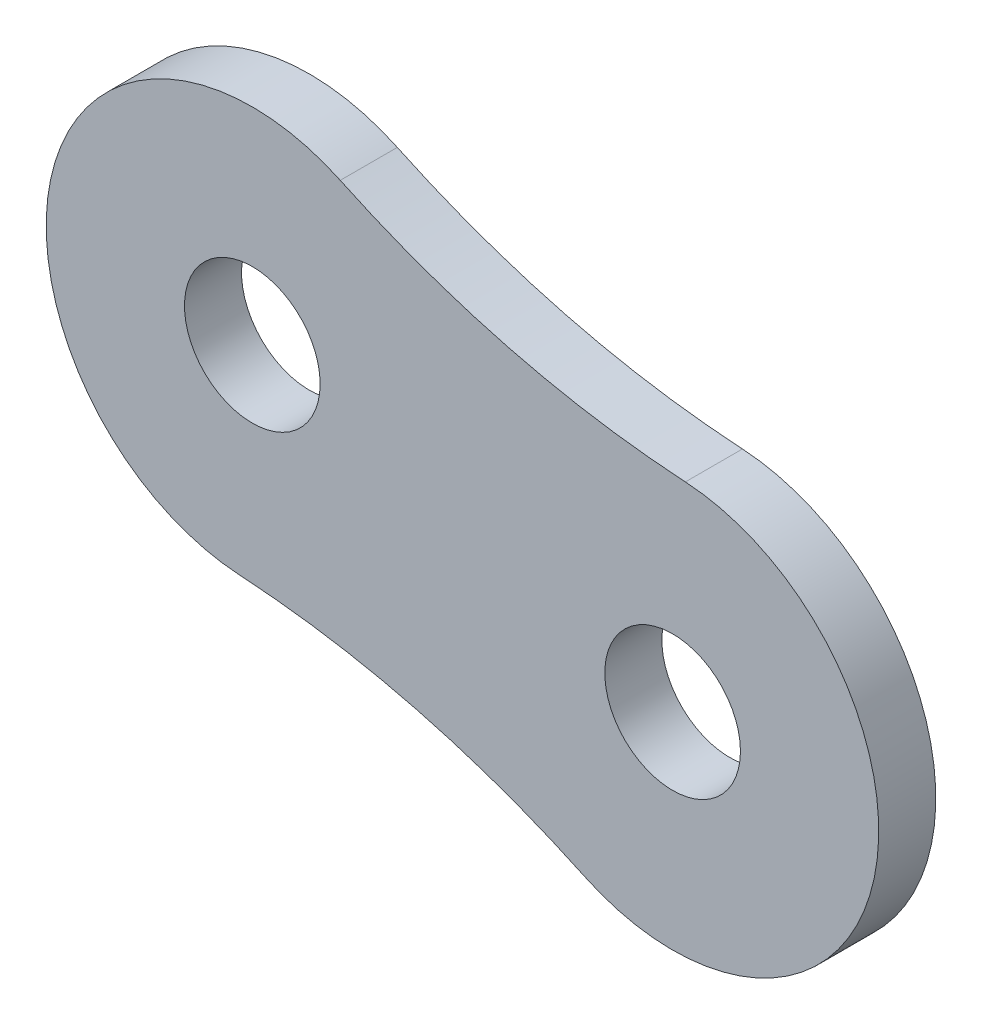
ISO-10303-21;
HEADER;
FILE_DESCRIPTION(('STEP AP214'),'2;1');
FILE_NAME('part.step','',(''),(''),'','','');
FILE_SCHEMA(('AUTOMOTIVE_DESIGN { 1 0 10303 214 1 1 1 1 }'));
ENDSEC;
DATA;
#1=APPLICATION_CONTEXT('core data for automotive mechanical design processes');
#2=APPLICATION_PROTOCOL_DEFINITION('international standard','automotive_design',2000,#1);
#3=PRODUCT_CONTEXT('',#1,'mechanical');
#4=PRODUCT('Part','Part','',(#3));
#5=PRODUCT_RELATED_PRODUCT_CATEGORY('part','',(#4));
#6=PRODUCT_DEFINITION_FORMATION('','',#4);
#7=PRODUCT_DEFINITION_CONTEXT('part definition',#1,'design');
#8=PRODUCT_DEFINITION('design','',#6,#7);
#9=PRODUCT_DEFINITION_SHAPE('','',#8);
#10=(LENGTH_UNIT() NAMED_UNIT(*) SI_UNIT(.MILLI.,.METRE.));
#11=(NAMED_UNIT(*) PLANE_ANGLE_UNIT() SI_UNIT($,.RADIAN.));
#12=(NAMED_UNIT(*) SI_UNIT($,.STERADIAN.) SOLID_ANGLE_UNIT());
#13=UNCERTAINTY_MEASURE_WITH_UNIT(LENGTH_MEASURE(1.E-05),#10,'distance_accuracy_value','');
#14=(GEOMETRIC_REPRESENTATION_CONTEXT(3) GLOBAL_UNCERTAINTY_ASSIGNED_CONTEXT((#13)) GLOBAL_UNIT_ASSIGNED_CONTEXT((#10,
#11,#12)) REPRESENTATION_CONTEXT('',''));
#15=CARTESIAN_POINT('',(0.,0.,0.));
#16=DIRECTION('',(0.,0.,1.));
#17=DIRECTION('',(1.,0.,0.));
#18=AXIS2_PLACEMENT_3D('',#15,#16,#17);
#19=CARTESIAN_POINT('',(39.3879759402037,27.3413775596349,14.645));
#20=DIRECTION('',(0.,0.,1.));
#21=DIRECTION('',(1.,0.,0.));
#22=AXIS2_PLACEMENT_3D('',#19,#20,#21);
#23=PLANE('',#22);
#24=CARTESIAN_POINT('',(12.7,0.,14.645));
#25=DIRECTION('',(0.,0.,1.));
#26=DIRECTION('',(1.,0.,0.));
#27=AXIS2_PLACEMENT_3D('',#24,#25,#26);
#28=CIRCLE('',#27,3.97);
#29=CARTESIAN_POINT('',(16.67,0.,14.645));
#30=VERTEX_POINT('',#29);
#31=EDGE_CURVE('E98',#30,#30,#28,.T.);
#32=ORIENTED_EDGE('',*,*,#31,.F.);
#33=EDGE_LOOP('',(#32));
#34=FACE_BOUND('',#33,.T.);
#35=CARTESIAN_POINT('',(41.4739395877496,60.9994782532944,14.645));
#36=DIRECTION('',(0.,0.,-1.));
#37=DIRECTION('',(1.,0.,0.));
#38=AXIS2_PLACEMENT_3D('',#35,#36,#37);
#39=CIRCLE('',#38,55.380355263158);
#40=CARTESIAN_POINT('',(38.0483098341102,5.7251731028488,14.645));
#41=VERTEX_POINT('',#40);
#42=CARTESIAN_POINT('',(17.8472422344231,10.9119256953194,14.645));
#43=VERTEX_POINT('',#42);
#44=EDGE_CURVE('E83',#41,#43,#39,.T.);
#45=ORIENTED_EDGE('',*,*,#44,.T.);
#46=CARTESIAN_POINT('',(12.7,0.,14.645));
#47=DIRECTION('',(0.,0.,1.));
#48=DIRECTION('',(1.,0.,0.));
#49=AXIS2_PLACEMENT_3D('',#46,#47,#48);
#50=CIRCLE('',#49,12.065);
#51=CARTESIAN_POINT('',(11.9537024585475,-12.0418962368732,14.645));
#52=VERTEX_POINT('',#51);
#53=EDGE_CURVE('E78',#43,#52,#50,.T.);
#54=ORIENTED_EDGE('',*,*,#53,.T.);
#55=CARTESIAN_POINT('',(8.52807270490808,-67.3162013873188,14.645));
#56=DIRECTION('',(0.,0.,-1.));
#57=DIRECTION('',(-1.,0.,0.));
#58=AXIS2_PLACEMENT_3D('',#55,#56,#57);
#59=CIRCLE('',#58,55.380355263158);
#60=CARTESIAN_POINT('',(32.1547700582346,-17.2286488293438,14.645));
#61=VERTEX_POINT('',#60);
#62=EDGE_CURVE('E81',#52,#61,#59,.T.);
#63=ORIENTED_EDGE('',*,*,#62,.T.);
#64=CARTESIAN_POINT('',(37.3020122926577,-6.31672313402445,14.645));
#65=DIRECTION('',(0.,0.,1.));
#66=DIRECTION('',(1.,0.,0.));
#67=AXIS2_PLACEMENT_3D('',#64,#65,#66);
#68=CIRCLE('',#67,12.065);
#69=EDGE_CURVE('E48',#61,#41,#68,.T.);
#70=ORIENTED_EDGE('',*,*,#69,.T.);
#71=EDGE_LOOP('',(#45,#54,#63,#70));
#72=FACE_BOUND('',#71,.T.);
#73=CARTESIAN_POINT('',(37.3020122926577,-6.31672313402445,14.645));
#74=DIRECTION('',(0.,0.,1.));
#75=DIRECTION('',(1.,0.,0.));
#76=AXIS2_PLACEMENT_3D('',#73,#74,#75);
#77=CIRCLE('',#76,3.97);
#78=CARTESIAN_POINT('',(41.2720122926577,-6.31672313402445,14.645));
#79=VERTEX_POINT('',#78);
#80=EDGE_CURVE('E113',#79,#79,#77,.T.);
#81=ORIENTED_EDGE('',*,*,#80,.F.);
#82=EDGE_LOOP('',(#81));
#83=FACE_BOUND('',#82,.T.);
#84=ADVANCED_FACE('F31',(#34,#72,#83),#23,.T.);
#85=CARTESIAN_POINT('',(39.3879759402037,27.3413775596349,11.305));
#86=DIRECTION('',(0.,0.,1.));
#87=DIRECTION('',(1.,0.,0.));
#88=AXIS2_PLACEMENT_3D('',#85,#86,#87);
#89=PLANE('',#88);
#90=CARTESIAN_POINT('',(12.7,0.,11.305));
#91=DIRECTION('',(0.,0.,1.));
#92=DIRECTION('',(1.,0.,0.));
#93=AXIS2_PLACEMENT_3D('',#90,#91,#92);
#94=CIRCLE('',#93,3.97);
#95=CARTESIAN_POINT('',(16.67,0.,11.305));
#96=VERTEX_POINT('',#95);
#97=EDGE_CURVE('E110',#96,#96,#94,.T.);
#98=ORIENTED_EDGE('',*,*,#97,.T.);
#99=EDGE_LOOP('',(#98));
#100=FACE_BOUND('',#99,.T.);
#101=CARTESIAN_POINT('',(41.4739395877496,60.9994782532944,11.305));
#102=DIRECTION('',(0.,0.,-1.));
#103=DIRECTION('',(1.,0.,0.));
#104=AXIS2_PLACEMENT_3D('',#101,#102,#103);
#105=CIRCLE('',#104,55.380355263158);
#106=CARTESIAN_POINT('',(38.0483098341102,5.7251731028488,11.305));
#107=VERTEX_POINT('',#106);
#108=CARTESIAN_POINT('',(17.8472422344231,10.9119256953194,11.305));
#109=VERTEX_POINT('',#108);
#110=EDGE_CURVE('E95',#107,#109,#105,.T.);
#111=ORIENTED_EDGE('',*,*,#110,.F.);
#112=CARTESIAN_POINT('',(37.3020122926577,-6.31672313402445,11.305));
#113=DIRECTION('',(0.,0.,1.));
#114=DIRECTION('',(1.,0.,0.));
#115=AXIS2_PLACEMENT_3D('',#112,#113,#114);
#116=CIRCLE('',#115,12.065);
#117=CARTESIAN_POINT('',(32.1547700582346,-17.2286488293438,11.305));
#118=VERTEX_POINT('',#117);
#119=EDGE_CURVE('E71',#118,#107,#116,.T.);
#120=ORIENTED_EDGE('',*,*,#119,.F.);
#121=CARTESIAN_POINT('',(8.52807270490808,-67.3162013873188,11.305));
#122=DIRECTION('',(0.,0.,-1.));
#123=DIRECTION('',(-1.,0.,0.));
#124=AXIS2_PLACEMENT_3D('',#121,#122,#123);
#125=CIRCLE('',#124,55.380355263158);
#126=CARTESIAN_POINT('',(11.9537024585475,-12.0418962368732,11.305));
#127=VERTEX_POINT('',#126);
#128=EDGE_CURVE('E65',#127,#118,#125,.T.);
#129=ORIENTED_EDGE('',*,*,#128,.F.);
#130=CARTESIAN_POINT('',(12.7,0.,11.305));
#131=DIRECTION('',(0.,0.,1.));
#132=DIRECTION('',(1.,0.,0.));
#133=AXIS2_PLACEMENT_3D('',#130,#131,#132);
#134=CIRCLE('',#133,12.065);
#135=EDGE_CURVE('E87',#109,#127,#134,.T.);
#136=ORIENTED_EDGE('',*,*,#135,.F.);
#137=EDGE_LOOP('',(#111,#120,#129,#136));
#138=FACE_BOUND('',#137,.T.);
#139=CARTESIAN_POINT('',(37.3020122926577,-6.31672313402445,11.305));
#140=DIRECTION('',(0.,0.,1.));
#141=DIRECTION('',(1.,0.,0.));
#142=AXIS2_PLACEMENT_3D('',#139,#140,#141);
#143=CIRCLE('',#142,3.97);
#144=CARTESIAN_POINT('',(41.2720122926577,-6.31672313402445,11.305));
#145=VERTEX_POINT('',#144);
#146=EDGE_CURVE('E116',#145,#145,#143,.T.);
#147=ORIENTED_EDGE('',*,*,#146,.T.);
#148=EDGE_LOOP('',(#147));
#149=FACE_BOUND('',#148,.T.);
#150=ADVANCED_FACE('F106',(#100,#138,#149),#89,.F.);
#151=CARTESIAN_POINT('',(41.4739395877496,60.9994782532944,14.645));
#152=DIRECTION('',(0.,0.,-1.));
#153=DIRECTION('',(-1.,0.,0.));
#154=AXIS2_PLACEMENT_3D('',#151,#152,#153);
#155=CYLINDRICAL_SURFACE('',#154,55.380355263158);
#156=ORIENTED_EDGE('',*,*,#110,.T.);
#157=DIRECTION('',(0.,0.,-1.));
#158=VECTOR('',#157,1.);
#159=CARTESIAN_POINT('',(17.8472422344231,10.9119256953194,14.645));
#160=LINE('',#159,#158);
#161=EDGE_CURVE('E11',#43,#109,#160,.T.);
#162=ORIENTED_EDGE('',*,*,#161,.F.);
#163=ORIENTED_EDGE('',*,*,#44,.F.);
#164=DIRECTION('',(0.,0.,-1.));
#165=VECTOR('',#164,1.);
#166=CARTESIAN_POINT('',(38.0483098341102,5.7251731028488,14.645));
#167=LINE('',#166,#165);
#168=EDGE_CURVE('E91',#41,#107,#167,.T.);
#169=ORIENTED_EDGE('',*,*,#168,.T.);
#170=EDGE_LOOP('',(#156,#162,#163,#169));
#171=FACE_BOUND('',#170,.T.);
#172=ADVANCED_FACE('F33',(#171),#155,.F.);
#173=CARTESIAN_POINT('',(12.7,0.,14.645));
#174=DIRECTION('',(0.,0.,-1.));
#175=DIRECTION('',(-1.,0.,0.));
#176=AXIS2_PLACEMENT_3D('',#173,#174,#175);
#177=CYLINDRICAL_SURFACE('',#176,12.065);
#178=ORIENTED_EDGE('',*,*,#135,.T.);
#179=DIRECTION('',(0.,0.,-1.));
#180=VECTOR('',#179,1.);
#181=CARTESIAN_POINT('',(11.9537024585475,-12.0418962368732,14.645));
#182=LINE('',#181,#180);
#183=EDGE_CURVE('E40',#52,#127,#182,.T.);
#184=ORIENTED_EDGE('',*,*,#183,.F.);
#185=ORIENTED_EDGE('',*,*,#53,.F.);
#186=ORIENTED_EDGE('',*,*,#161,.T.);
#187=EDGE_LOOP('',(#178,#184,#185,#186));
#188=FACE_BOUND('',#187,.T.);
#189=ADVANCED_FACE('F86',(#188),#177,.T.);
#190=CARTESIAN_POINT('',(8.52807270490808,-67.3162013873188,14.645));
#191=DIRECTION('',(0.,0.,-1.));
#192=DIRECTION('',(-1.,0.,0.));
#193=AXIS2_PLACEMENT_3D('',#190,#191,#192);
#194=CYLINDRICAL_SURFACE('',#193,55.380355263158);
#195=ORIENTED_EDGE('',*,*,#128,.T.);
#196=DIRECTION('',(0.,0.,-1.));
#197=VECTOR('',#196,1.);
#198=CARTESIAN_POINT('',(32.1547700582346,-17.2286488293438,14.645));
#199=LINE('',#198,#197);
#200=EDGE_CURVE('E88',#61,#118,#199,.T.);
#201=ORIENTED_EDGE('',*,*,#200,.F.);
#202=ORIENTED_EDGE('',*,*,#62,.F.);
#203=ORIENTED_EDGE('',*,*,#183,.T.);
#204=EDGE_LOOP('',(#195,#201,#202,#203));
#205=FACE_BOUND('',#204,.T.);
#206=ADVANCED_FACE('F89',(#205),#194,.F.);
#207=CARTESIAN_POINT('',(37.3020122926577,-6.31672313402445,14.645));
#208=DIRECTION('',(0.,0.,-1.));
#209=DIRECTION('',(-1.,0.,0.));
#210=AXIS2_PLACEMENT_3D('',#207,#208,#209);
#211=CYLINDRICAL_SURFACE('',#210,12.065);
#212=ORIENTED_EDGE('',*,*,#119,.T.);
#213=ORIENTED_EDGE('',*,*,#168,.F.);
#214=ORIENTED_EDGE('',*,*,#69,.F.);
#215=ORIENTED_EDGE('',*,*,#200,.T.);
#216=EDGE_LOOP('',(#212,#213,#214,#215));
#217=FACE_BOUND('',#216,.T.);
#218=ADVANCED_FACE('F103',(#217),#211,.T.);
#219=CARTESIAN_POINT('',(12.7,0.,14.645));
#220=DIRECTION('',(0.,0.,-1.));
#221=DIRECTION('',(-1.,0.,0.));
#222=AXIS2_PLACEMENT_3D('',#219,#220,#221);
#223=CYLINDRICAL_SURFACE('',#222,3.97);
#224=ORIENTED_EDGE('',*,*,#31,.T.);
#225=EDGE_LOOP('',(#224));
#226=FACE_BOUND('',#225,.T.);
#227=ORIENTED_EDGE('',*,*,#97,.F.);
#228=EDGE_LOOP('',(#227));
#229=FACE_BOUND('',#228,.T.);
#230=ADVANCED_FACE('F134',(#226,#229),#223,.F.);
#231=CARTESIAN_POINT('',(37.3020122926577,-6.31672313402445,14.645));
#232=DIRECTION('',(0.,0.,-1.));
#233=DIRECTION('',(-1.,0.,0.));
#234=AXIS2_PLACEMENT_3D('',#231,#232,#233);
#235=CYLINDRICAL_SURFACE('',#234,3.97);
#236=ORIENTED_EDGE('',*,*,#80,.T.);
#237=EDGE_LOOP('',(#236));
#238=FACE_BOUND('',#237,.T.);
#239=ORIENTED_EDGE('',*,*,#146,.F.);
#240=EDGE_LOOP('',(#239));
#241=FACE_BOUND('',#240,.T.);
#242=ADVANCED_FACE('F122',(#238,#241),#235,.F.);
#243=CLOSED_SHELL('',(#84,#150,#172,#189,#206,#218,#230,#242));
#244=MANIFOLD_SOLID_BREP('B2',#243);
#245=ADVANCED_BREP_SHAPE_REPRESENTATION('',(#18,#244),#14);
#246=SHAPE_DEFINITION_REPRESENTATION(#9,#245);
ENDSEC;
END-ISO-10303-21;
